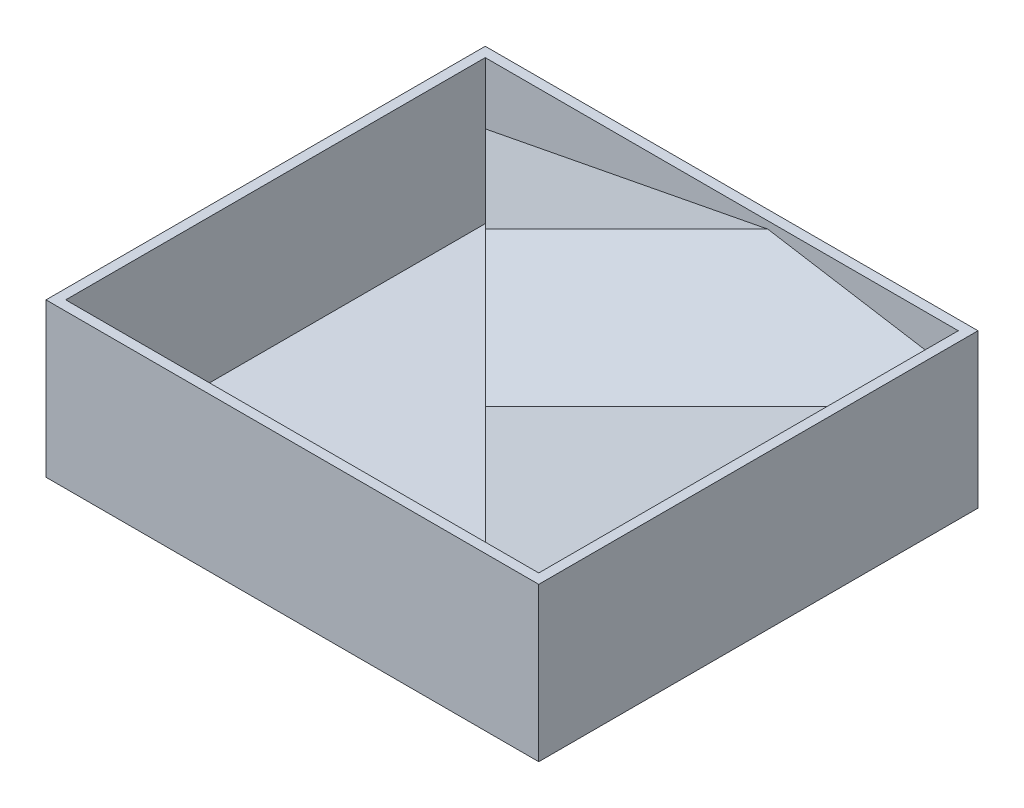
ISO-10303-21;
HEADER;
FILE_DESCRIPTION(('STEP AP214'),'2;1');
FILE_NAME('part.step','',(''),(''),'','','');
FILE_SCHEMA(('AUTOMOTIVE_DESIGN { 1 0 10303 214 1 1 1 1 }'));
ENDSEC;
DATA;
#1=APPLICATION_CONTEXT('core data for automotive mechanical design processes');
#2=APPLICATION_PROTOCOL_DEFINITION('international standard','automotive_design',2000,#1);
#3=PRODUCT_CONTEXT('',#1,'mechanical');
#4=PRODUCT('Part','Part','',(#3));
#5=PRODUCT_RELATED_PRODUCT_CATEGORY('part','',(#4));
#6=PRODUCT_DEFINITION_FORMATION('','',#4);
#7=PRODUCT_DEFINITION_CONTEXT('part definition',#1,'design');
#8=PRODUCT_DEFINITION('design','',#6,#7);
#9=PRODUCT_DEFINITION_SHAPE('','',#8);
#10=(LENGTH_UNIT() NAMED_UNIT(*) SI_UNIT(.MILLI.,.METRE.));
#11=(NAMED_UNIT(*) PLANE_ANGLE_UNIT() SI_UNIT($,.RADIAN.));
#12=(NAMED_UNIT(*) SI_UNIT($,.STERADIAN.) SOLID_ANGLE_UNIT());
#13=UNCERTAINTY_MEASURE_WITH_UNIT(LENGTH_MEASURE(1.E-05),#10,'distance_accuracy_value','');
#14=(GEOMETRIC_REPRESENTATION_CONTEXT(3) GLOBAL_UNCERTAINTY_ASSIGNED_CONTEXT((#13)) GLOBAL_UNIT_ASSIGNED_CONTEXT((#10,
#11,#12)) REPRESENTATION_CONTEXT('',''));
#15=CARTESIAN_POINT('',(0.,0.,0.));
#16=DIRECTION('',(0.,0.,1.));
#17=DIRECTION('',(1.,0.,0.));
#18=AXIS2_PLACEMENT_3D('',#15,#16,#17);
#19=CARTESIAN_POINT('',(62.0602912861796,39.624,-63.9370439423789));
#20=DIRECTION('',(-1.,0.,0.));
#21=DIRECTION('',(0.,0.,1.));
#22=AXIS2_PLACEMENT_3D('',#19,#20,#21);
#23=PLANE('',#22);
#24=DIRECTION('',(0.,-0.0967450022136603,-0.995309200473239));
#25=VECTOR('',#24,1.);
#26=CARTESIAN_POINT('',(62.0602912861796,24.2577204448423,-62.4434269348474));
#27=LINE('',#26,#25);
#28=CARTESIAN_POINT('',(62.0602912861796,34.8768301423718,46.8056023787655));
#29=VERTEX_POINT('',#28);
#30=CARTESIAN_POINT('',(62.0602912861796,25.357,-51.1340773032851));
#31=VERTEX_POINT('',#30);
#32=EDGE_CURVE('E51',#29,#31,#27,.T.);
#33=ORIENTED_EDGE('',*,*,#32,.T.);
#34=DIRECTION('',(0.,0.162584559288982,-0.986694613890644));
#35=VECTOR('',#34,1.);
#36=CARTESIAN_POINT('',(62.0602912861796,27.7879988198752,-65.8873444796714));
#37=LINE('',#36,#35);
#38=CARTESIAN_POINT('',(62.0602912861796,27.0481006551816,-61.397043942379));
#39=VERTEX_POINT('',#38);
#40=EDGE_CURVE('E190',#31,#39,#37,.T.);
#41=ORIENTED_EDGE('',*,*,#40,.T.);
#42=DIRECTION('',(0.,-1.,0.));
#43=VECTOR('',#42,1.);
#44=CARTESIAN_POINT('',(62.0602912861796,39.624,-61.397043942379));
#45=LINE('',#44,#43);
#46=CARTESIAN_POINT('',(62.0602912861796,2.54,-61.397043942379));
#47=VERTEX_POINT('',#46);
#48=EDGE_CURVE('E218',#39,#47,#45,.T.);
#49=ORIENTED_EDGE('',*,*,#48,.T.);
#50=DIRECTION('',(0.,0.,-1.));
#51=VECTOR('',#50,1.);
#52=CARTESIAN_POINT('',(62.0602912861796,2.54,-63.9370439423789));
#53=LINE('',#52,#51);
#54=CARTESIAN_POINT('',(62.0602912861796,2.54,46.8056023787655));
#55=VERTEX_POINT('',#54);
#56=EDGE_CURVE('E221',#55,#47,#53,.T.);
#57=ORIENTED_EDGE('',*,*,#56,.F.);
#58=DIRECTION('',(0.,-1.,0.));
#59=VECTOR('',#58,1.);
#60=CARTESIAN_POINT('',(62.0602912861796,39.624,46.8056023787655));
#61=LINE('',#60,#59);
#62=EDGE_CURVE('E227',#29,#55,#61,.T.);
#63=ORIENTED_EDGE('',*,*,#62,.F.);
#64=EDGE_LOOP('',(#33,#41,#49,#57,#63));
#65=FACE_BOUND('',#64,.T.);
#66=ADVANCED_FACE('F43',(#65),#23,.T.);
#67=CARTESIAN_POINT('',(-62.4778997860176,39.624,-61.397043942379));
#68=DIRECTION('',(0.,0.,1.));
#69=DIRECTION('',(1.,0.,0.));
#70=AXIS2_PLACEMENT_3D('',#67,#68,#69);
#71=PLANE('',#70);
#72=DIRECTION('',(-0.986694613890644,0.162584559288982,0.));
#73=VECTOR('',#72,1.);
#74=CARTESIAN_POINT('',(-61.2033319918938,47.3591083214804,-61.397043942379));
#75=LINE('',#74,#73);
#76=CARTESIAN_POINT('',(12.9885137023479,35.134,-61.397043942379));
#77=VERTEX_POINT('',#76);
#78=EDGE_CURVE('E272',#39,#77,#75,.T.);
#79=ORIENTED_EDGE('',*,*,#78,.T.);
#80=DIRECTION('',(-0.981937401623452,-0.189206076258095,0.));
#81=VECTOR('',#80,1.);
#82=CARTESIAN_POINT('',(-58.9420917631022,21.2739437474469,-61.397043942379));
#83=LINE('',#82,#81);
#84=CARTESIAN_POINT('',(-59.9378997860176,21.0820649897881,-61.397043942379));
#85=VERTEX_POINT('',#84);
#86=EDGE_CURVE('E274',#77,#85,#83,.T.);
#87=ORIENTED_EDGE('',*,*,#86,.T.);
#88=DIRECTION('',(0.,-1.,0.));
#89=VECTOR('',#88,1.);
#90=CARTESIAN_POINT('',(-59.9378997860176,39.624,-61.397043942379));
#91=LINE('',#90,#89);
#92=CARTESIAN_POINT('',(-59.9378997860176,2.54,-61.397043942379));
#93=VERTEX_POINT('',#92);
#94=EDGE_CURVE('E222',#85,#93,#91,.T.);
#95=ORIENTED_EDGE('',*,*,#94,.T.);
#96=DIRECTION('',(-1.,0.,0.));
#97=VECTOR('',#96,1.);
#98=CARTESIAN_POINT('',(-62.4778997860176,2.54,-61.397043942379));
#99=LINE('',#98,#97);
#100=EDGE_CURVE('E229',#47,#93,#99,.T.);
#101=ORIENTED_EDGE('',*,*,#100,.F.);
#102=ORIENTED_EDGE('',*,*,#48,.F.);
#103=EDGE_LOOP('',(#79,#87,#95,#101,#102));
#104=FACE_BOUND('',#103,.T.);
#105=ADVANCED_FACE('F308',(#104),#71,.T.);
#106=CARTESIAN_POINT('',(-62.4778997860176,39.624,-63.9370439423789));
#107=DIRECTION('',(1.,0.,0.));
#108=DIRECTION('',(0.,0.,-1.));
#109=AXIS2_PLACEMENT_3D('',#106,#107,#108);
#110=PLANE('',#109);
#111=DIRECTION('',(0.,0.,1.));
#112=VECTOR('',#111,1.);
#113=CARTESIAN_POINT('',(-62.4778997860176,0.,-63.9370439423789));
#114=LINE('',#113,#112);
#115=CARTESIAN_POINT('',(-62.4778997860176,0.,-63.9370439423789));
#116=VERTEX_POINT('',#115);
#117=CARTESIAN_POINT('',(-62.4778997860176,0.,49.3456023787655));
#118=VERTEX_POINT('',#117);
#119=EDGE_CURVE('E211',#116,#118,#114,.T.);
#120=ORIENTED_EDGE('',*,*,#119,.T.);
#121=DIRECTION('',(0.,-1.,0.));
#122=VECTOR('',#121,1.);
#123=CARTESIAN_POINT('',(-62.4778997860176,39.624,49.3456023787655));
#124=LINE('',#123,#122);
#125=CARTESIAN_POINT('',(-62.4778997860176,39.624,49.3456023787655));
#126=VERTEX_POINT('',#125);
#127=EDGE_CURVE('E270',#126,#118,#124,.T.);
#128=ORIENTED_EDGE('',*,*,#127,.F.);
#129=DIRECTION('',(0.,0.,1.));
#130=VECTOR('',#129,1.);
#131=CARTESIAN_POINT('',(-62.4778997860176,39.624,-63.9370439423789));
#132=LINE('',#131,#130);
#133=CARTESIAN_POINT('',(-62.4778997860176,39.624,-63.9370439423789));
#134=VERTEX_POINT('',#133);
#135=EDGE_CURVE('E245',#134,#126,#132,.T.);
#136=ORIENTED_EDGE('',*,*,#135,.F.);
#137=DIRECTION('',(0.,-1.,0.));
#138=VECTOR('',#137,1.);
#139=CARTESIAN_POINT('',(-62.4778997860176,39.624,-63.9370439423789));
#140=LINE('',#139,#138);
#141=EDGE_CURVE('E255',#134,#116,#140,.T.);
#142=ORIENTED_EDGE('',*,*,#141,.T.);
#143=EDGE_LOOP('',(#120,#128,#136,#142));
#144=FACE_BOUND('',#143,.T.);
#145=ADVANCED_FACE('F44',(#144),#110,.F.);
#146=CARTESIAN_POINT('',(-62.4778997860176,39.624,49.3456023787655));
#147=DIRECTION('',(0.,0.,-1.));
#148=DIRECTION('',(-1.,0.,0.));
#149=AXIS2_PLACEMENT_3D('',#146,#147,#148);
#150=PLANE('',#149);
#151=DIRECTION('',(1.,0.,0.));
#152=VECTOR('',#151,1.);
#153=CARTESIAN_POINT('',(-62.4778997860176,0.,49.3456023787655));
#154=LINE('',#153,#152);
#155=CARTESIAN_POINT('',(64.6002912861796,0.,49.3456023787655));
#156=VERTEX_POINT('',#155);
#157=EDGE_CURVE('E253',#118,#156,#154,.T.);
#158=ORIENTED_EDGE('',*,*,#157,.T.);
#159=DIRECTION('',(0.,-1.,0.));
#160=VECTOR('',#159,1.);
#161=CARTESIAN_POINT('',(64.6002912861796,39.624,49.3456023787655));
#162=LINE('',#161,#160);
#163=CARTESIAN_POINT('',(64.6002912861796,39.624,49.3456023787655));
#164=VERTEX_POINT('',#163);
#165=EDGE_CURVE('E267',#164,#156,#162,.T.);
#166=ORIENTED_EDGE('',*,*,#165,.F.);
#167=DIRECTION('',(1.,0.,0.));
#168=VECTOR('',#167,1.);
#169=CARTESIAN_POINT('',(-62.4778997860176,39.624,49.3456023787655));
#170=LINE('',#169,#168);
#171=EDGE_CURVE('E244',#126,#164,#170,.T.);
#172=ORIENTED_EDGE('',*,*,#171,.F.);
#173=ORIENTED_EDGE('',*,*,#127,.T.);
#174=EDGE_LOOP('',(#158,#166,#172,#173));
#175=FACE_BOUND('',#174,.T.);
#176=ADVANCED_FACE('F328',(#175),#150,.F.);
#177=CARTESIAN_POINT('',(64.6002912861796,39.624,-63.9370439423789));
#178=DIRECTION('',(-1.,0.,0.));
#179=DIRECTION('',(0.,0.,1.));
#180=AXIS2_PLACEMENT_3D('',#177,#178,#179);
#181=PLANE('',#180);
#182=DIRECTION('',(0.,0.,-1.));
#183=VECTOR('',#182,1.);
#184=CARTESIAN_POINT('',(64.6002912861796,0.,-63.9370439423789));
#185=LINE('',#184,#183);
#186=CARTESIAN_POINT('',(64.6002912861796,0.,-63.9370439423789));
#187=VERTEX_POINT('',#186);
#188=EDGE_CURVE('E259',#156,#187,#185,.T.);
#189=ORIENTED_EDGE('',*,*,#188,.T.);
#190=DIRECTION('',(0.,-1.,0.));
#191=VECTOR('',#190,1.);
#192=CARTESIAN_POINT('',(64.6002912861796,39.624,-63.9370439423789));
#193=LINE('',#192,#191);
#194=CARTESIAN_POINT('',(64.6002912861796,39.624,-63.9370439423789));
#195=VERTEX_POINT('',#194);
#196=EDGE_CURVE('E263',#195,#187,#193,.T.);
#197=ORIENTED_EDGE('',*,*,#196,.F.);
#198=DIRECTION('',(0.,0.,-1.));
#199=VECTOR('',#198,1.);
#200=CARTESIAN_POINT('',(64.6002912861796,39.624,-63.9370439423789));
#201=LINE('',#200,#199);
#202=EDGE_CURVE('E247',#164,#195,#201,.T.);
#203=ORIENTED_EDGE('',*,*,#202,.F.);
#204=ORIENTED_EDGE('',*,*,#165,.T.);
#205=EDGE_LOOP('',(#189,#197,#203,#204));
#206=FACE_BOUND('',#205,.T.);
#207=ADVANCED_FACE('F331',(#206),#181,.F.);
#208=CARTESIAN_POINT('',(-62.4778997860176,39.624,-63.9370439423789));
#209=DIRECTION('',(0.,0.,1.));
#210=DIRECTION('',(1.,0.,0.));
#211=AXIS2_PLACEMENT_3D('',#208,#209,#210);
#212=PLANE('',#211);
#213=DIRECTION('',(-1.,0.,0.));
#214=VECTOR('',#213,1.);
#215=CARTESIAN_POINT('',(-62.4778997860176,0.,-63.9370439423789));
#216=LINE('',#215,#214);
#217=EDGE_CURVE('E246',#187,#116,#216,.T.);
#218=ORIENTED_EDGE('',*,*,#217,.T.);
#219=ORIENTED_EDGE('',*,*,#141,.F.);
#220=DIRECTION('',(-1.,0.,0.));
#221=VECTOR('',#220,1.);
#222=CARTESIAN_POINT('',(-62.4778997860176,39.624,-63.9370439423789));
#223=LINE('',#222,#221);
#224=EDGE_CURVE('E249',#195,#134,#223,.T.);
#225=ORIENTED_EDGE('',*,*,#224,.F.);
#226=ORIENTED_EDGE('',*,*,#196,.T.);
#227=EDGE_LOOP('',(#218,#219,#225,#226));
#228=FACE_BOUND('',#227,.T.);
#229=ADVANCED_FACE('F316',(#228),#212,.F.);
#230=CARTESIAN_POINT('',(0.,39.624,0.));
#231=DIRECTION('',(0.,1.,0.));
#232=DIRECTION('',(0.,0.,1.));
#233=AXIS2_PLACEMENT_3D('',#230,#231,#232);
#234=PLANE('',#233);
#235=DIRECTION('',(0.,0.,1.));
#236=VECTOR('',#235,1.);
#237=CARTESIAN_POINT('',(-59.9378997860176,39.624,-63.9370439423789));
#238=LINE('',#237,#236);
#239=CARTESIAN_POINT('',(-59.9378997860176,39.624,-61.397043942379));
#240=VERTEX_POINT('',#239);
#241=CARTESIAN_POINT('',(-59.9378997860176,39.624,46.8056023787655));
#242=VERTEX_POINT('',#241);
#243=EDGE_CURVE('E234',#240,#242,#238,.T.);
#244=ORIENTED_EDGE('',*,*,#243,.F.);
#245=DIRECTION('',(-1.,0.,0.));
#246=VECTOR('',#245,1.);
#247=CARTESIAN_POINT('',(-62.4778997860176,39.624,-61.397043942379));
#248=LINE('',#247,#246);
#249=CARTESIAN_POINT('',(62.0602912861796,39.624,-61.397043942379));
#250=VERTEX_POINT('',#249);
#251=EDGE_CURVE('E239',#250,#240,#248,.T.);
#252=ORIENTED_EDGE('',*,*,#251,.F.);
#253=DIRECTION('',(0.,0.,-1.));
#254=VECTOR('',#253,1.);
#255=CARTESIAN_POINT('',(62.0602912861796,39.624,-63.9370439423789));
#256=LINE('',#255,#254);
#257=CARTESIAN_POINT('',(62.0602912861796,39.624,46.8056023787655));
#258=VERTEX_POINT('',#257);
#259=EDGE_CURVE('E238',#258,#250,#256,.T.);
#260=ORIENTED_EDGE('',*,*,#259,.F.);
#261=DIRECTION('',(1.,0.,0.));
#262=VECTOR('',#261,1.);
#263=CARTESIAN_POINT('',(-62.4778997860176,39.624,46.8056023787655));
#264=LINE('',#263,#262);
#265=EDGE_CURVE('E236',#242,#258,#264,.T.);
#266=ORIENTED_EDGE('',*,*,#265,.F.);
#267=EDGE_LOOP('',(#244,#252,#260,#266));
#268=FACE_BOUND('',#267,.T.);
#269=ORIENTED_EDGE('',*,*,#135,.T.);
#270=ORIENTED_EDGE('',*,*,#171,.T.);
#271=ORIENTED_EDGE('',*,*,#202,.T.);
#272=ORIENTED_EDGE('',*,*,#224,.T.);
#273=EDGE_LOOP('',(#269,#270,#271,#272));
#274=FACE_BOUND('',#273,.T.);
#275=ADVANCED_FACE('F313',(#268,#274),#234,.T.);
#276=CARTESIAN_POINT('',(0.,0.,0.));
#277=DIRECTION('',(0.,1.,0.));
#278=DIRECTION('',(0.,0.,1.));
#279=AXIS2_PLACEMENT_3D('',#276,#277,#278);
#280=PLANE('',#279);
#281=ORIENTED_EDGE('',*,*,#119,.F.);
#282=ORIENTED_EDGE('',*,*,#217,.F.);
#283=ORIENTED_EDGE('',*,*,#188,.F.);
#284=ORIENTED_EDGE('',*,*,#157,.F.);
#285=EDGE_LOOP('',(#281,#282,#283,#284));
#286=FACE_BOUND('',#285,.T.);
#287=ADVANCED_FACE('F319',(#286),#280,.F.);
#288=CARTESIAN_POINT('',(-59.9378997860176,39.624,-63.9370439423789));
#289=DIRECTION('',(1.,0.,0.));
#290=DIRECTION('',(0.,0.,-1.));
#291=AXIS2_PLACEMENT_3D('',#288,#289,#290);
#292=PLANE('',#291);
#293=DIRECTION('',(0.,0.,1.));
#294=VECTOR('',#293,1.);
#295=CARTESIAN_POINT('',(-59.9378997860176,2.54,-63.9370439423789));
#296=LINE('',#295,#294);
#297=CARTESIAN_POINT('',(-59.9378997860176,2.54,46.8056023787655));
#298=VERTEX_POINT('',#297);
#299=EDGE_CURVE('E198',#93,#298,#296,.T.);
#300=ORIENTED_EDGE('',*,*,#299,.F.);
#301=ORIENTED_EDGE('',*,*,#94,.F.);
#302=CARTESIAN_POINT('',(-59.9378997860176,23.7146817699346,-61.397043942379));
#303=VERTEX_POINT('',#302);
#304=EDGE_CURVE('E220',#303,#85,#91,.T.);
#305=ORIENTED_EDGE('',*,*,#304,.F.);
#306=EDGE_CURVE('E216',#240,#303,#91,.T.);
#307=ORIENTED_EDGE('',*,*,#306,.F.);
#308=ORIENTED_EDGE('',*,*,#243,.T.);
#309=DIRECTION('',(0.,-1.,0.));
#310=VECTOR('',#309,1.);
#311=CARTESIAN_POINT('',(-59.9378997860176,39.624,46.8056023787655));
#312=LINE('',#311,#310);
#313=EDGE_CURVE('E212',#242,#298,#312,.T.);
#314=ORIENTED_EDGE('',*,*,#313,.T.);
#315=EDGE_LOOP('',(#300,#301,#305,#307,#308,#314));
#316=FACE_BOUND('',#315,.T.);
#317=ADVANCED_FACE('F302',(#316),#292,.T.);
#318=CARTESIAN_POINT('',(-62.4778997860176,39.624,46.8056023787655));
#319=DIRECTION('',(0.,0.,-1.));
#320=DIRECTION('',(-1.,0.,0.));
#321=AXIS2_PLACEMENT_3D('',#318,#319,#320);
#322=PLANE('',#321);
#323=DIRECTION('',(0.995309200473239,0.0967450022136603,0.));
#324=VECTOR('',#323,1.);
#325=CARTESIAN_POINT('',(-61.1020416653543,25.4692197559756,46.8056023787655));
#326=LINE('',#325,#324);
#327=CARTESIAN_POINT('',(48.2647465351268,36.0997757294617,46.8056023787655));
#328=VERTEX_POINT('',#327);
#329=CARTESIAN_POINT('',(62.0602912861796,37.440715818074,46.8056023787655));
#330=VERTEX_POINT('',#329);
#331=EDGE_CURVE('E197',#328,#330,#326,.T.);
#332=ORIENTED_EDGE('',*,*,#331,.F.);
#333=DIRECTION('',(0.,1.,0.));
#334=VECTOR('',#333,1.);
#335=CARTESIAN_POINT('',(48.2647465351269,39.624,46.8056023787655));
#336=LINE('',#335,#334);
#337=CARTESIAN_POINT('',(48.2647465351268,33.5358900537595,46.8056023787655));
#338=VERTEX_POINT('',#337);
#339=EDGE_CURVE('E174',#338,#328,#336,.T.);
#340=ORIENTED_EDGE('',*,*,#339,.F.);
#341=DIRECTION('',(0.995309200473239,0.0967450022136603,0.));
#342=VECTOR('',#341,1.);
#343=CARTESIAN_POINT('',(-60.855162060558,22.9293310129866,46.8056023787655));
#344=LINE('',#343,#342);
#345=EDGE_CURVE('E200',#338,#29,#344,.T.);
#346=ORIENTED_EDGE('',*,*,#345,.T.);
#347=ORIENTED_EDGE('',*,*,#62,.T.);
#348=DIRECTION('',(1.,0.,0.));
#349=VECTOR('',#348,1.);
#350=CARTESIAN_POINT('',(-62.4778997860176,2.54,46.8056023787655));
#351=LINE('',#350,#349);
#352=EDGE_CURVE('E208',#298,#55,#351,.T.);
#353=ORIENTED_EDGE('',*,*,#352,.F.);
#354=ORIENTED_EDGE('',*,*,#313,.F.);
#355=ORIENTED_EDGE('',*,*,#265,.T.);
#356=EDGE_CURVE('E213',#258,#330,#61,.T.);
#357=ORIENTED_EDGE('',*,*,#356,.T.);
#358=EDGE_LOOP('',(#332,#340,#346,#347,#353,#354,#355,#357));
#359=FACE_BOUND('',#358,.T.);
#360=ADVANCED_FACE('F286',(#359),#322,.T.);
#361=DIRECTION('',(0.,0.162584559288982,-0.986694613890644));
#362=VECTOR('',#361,1.);
#363=CARTESIAN_POINT('',(62.0602912861796,30.3271112617618,-65.4689571979961));
#364=LINE('',#363,#362);
#365=CARTESIAN_POINT('',(62.0602912861796,27.9372729695821,-50.9654853967646));
#366=VERTEX_POINT('',#365);
#367=CARTESIAN_POINT('',(62.0602912861796,29.6561536900801,-61.397043942379));
#368=VERTEX_POINT('',#367);
#369=EDGE_CURVE('E204',#366,#368,#364,.T.);
#370=ORIENTED_EDGE('',*,*,#369,.F.);
#371=DIRECTION('',(0.,-0.0967450022136603,-0.995309200473239));
#372=VECTOR('',#371,1.);
#373=CARTESIAN_POINT('',(62.0602912861796,26.7976091878313,-62.6903065396437));
#374=LINE('',#373,#372);
#375=EDGE_CURVE('E11',#330,#366,#374,.T.);
#376=ORIENTED_EDGE('',*,*,#375,.F.);
#377=ORIENTED_EDGE('',*,*,#356,.F.);
#378=ORIENTED_EDGE('',*,*,#259,.T.);
#379=EDGE_CURVE('E66',#250,#368,#45,.T.);
#380=ORIENTED_EDGE('',*,*,#379,.T.);
#381=EDGE_LOOP('',(#370,#376,#377,#378,#380));
#382=FACE_BOUND('',#381,.T.);
#383=ADVANCED_FACE('F292',(#382),#23,.T.);
#384=DIRECTION('',(-0.981937401623452,-0.189206076258095,0.));
#385=VECTOR('',#384,1.);
#386=CARTESIAN_POINT('',(-59.431201746027,23.8123156392992,-61.397043942379));
#387=LINE('',#386,#385);
#388=CARTESIAN_POINT('',(12.9197969049129,37.753375981299,-61.397043942379));
#389=VERTEX_POINT('',#388);
#390=EDGE_CURVE('E276',#389,#303,#387,.T.);
#391=ORIENTED_EDGE('',*,*,#390,.F.);
#392=DIRECTION('',(-0.986694613890644,0.162584559288982,0.));
#393=VECTOR('',#392,1.);
#394=CARTESIAN_POINT('',(-60.7849447102186,49.8982207633671,-61.397043942379));
#395=LINE('',#394,#393);
#396=EDGE_CURVE('E280',#368,#389,#395,.T.);
#397=ORIENTED_EDGE('',*,*,#396,.F.);
#398=ORIENTED_EDGE('',*,*,#379,.F.);
#399=ORIENTED_EDGE('',*,*,#251,.T.);
#400=ORIENTED_EDGE('',*,*,#306,.T.);
#401=EDGE_LOOP('',(#391,#397,#398,#399,#400));
#402=FACE_BOUND('',#401,.T.);
#403=ADVANCED_FACE('F294',(#402),#71,.T.);
#404=CARTESIAN_POINT('',(0.,2.54,0.));
#405=DIRECTION('',(0.,1.,0.));
#406=DIRECTION('',(0.,0.,1.));
#407=AXIS2_PLACEMENT_3D('',#404,#405,#406);
#408=PLANE('',#407);
#409=ORIENTED_EDGE('',*,*,#299,.T.);
#410=ORIENTED_EDGE('',*,*,#352,.T.);
#411=ORIENTED_EDGE('',*,*,#56,.T.);
#412=ORIENTED_EDGE('',*,*,#100,.T.);
#413=EDGE_LOOP('',(#409,#410,#411,#412));
#414=FACE_BOUND('',#413,.T.);
#415=ADVANCED_FACE('F309',(#414),#408,.T.);
#416=CARTESIAN_POINT('',(79.5818776754174,39.624,78.122733519056));
#417=DIRECTION('',(-0.707106781186547,0.,0.707106781186548));
#418=DIRECTION('',(0.700519231896705,0.136182273022966,0.700519231896705));
#419=AXIS2_PLACEMENT_3D('',#416,#417,#418);
#420=PLANE('',#419);
#421=DIRECTION('',(0.700519231896705,0.136182273022966,0.700519231896705));
#422=VECTOR('',#421,1.);
#423=CARTESIAN_POINT('',(6.19267906962794,25.357,4.73353491326659));
#424=LINE('',#423,#422);
#425=CARTESIAN_POINT('',(6.19267906962794,25.357,4.73353491326659));
#426=VERTEX_POINT('',#425);
#427=EDGE_CURVE('E192',#426,#338,#424,.T.);
#428=ORIENTED_EDGE('',*,*,#427,.T.);
#429=ORIENTED_EDGE('',*,*,#339,.T.);
#430=DIRECTION('',(0.700519231896705,0.136182273022966,0.700519231896705));
#431=VECTOR('',#430,1.);
#432=CARTESIAN_POINT('',(5.94808873144882,27.8733368480668,4.48894457508747));
#433=LINE('',#432,#431);
#434=CARTESIAN_POINT('',(6.27697502288816,27.9372729695821,4.81783086652681));
#435=VERTEX_POINT('',#434);
#436=EDGE_CURVE('E171',#435,#328,#433,.T.);
#437=ORIENTED_EDGE('',*,*,#436,.F.);
#438=DIRECTION('',(0.688655943794372,-0.226949294234123,0.688655943794372));
#439=VECTOR('',#438,1.);
#440=CARTESIAN_POINT('',(-23.0670804840912,37.607722701828,-24.5262246404525));
#441=LINE('',#440,#439);
#442=CARTESIAN_POINT('',(-23.5090514405523,37.753375981299,-24.9681955969137));
#443=VERTEX_POINT('',#442);
#444=EDGE_CURVE('E160',#443,#435,#441,.T.);
#445=ORIENTED_EDGE('',*,*,#444,.F.);
#446=DIRECTION('',(0.682230409590376,0.262913172854267,0.682230409590375));
#447=VECTOR('',#446,1.);
#448=CARTESIAN_POINT('',(-60.4102739532484,23.5326415246814,-61.8694181096097));
#449=LINE('',#448,#447);
#450=EDGE_CURVE('E166',#303,#443,#449,.T.);
#451=ORIENTED_EDGE('',*,*,#450,.F.);
#452=ORIENTED_EDGE('',*,*,#304,.T.);
#453=DIRECTION('',(0.682230409590376,0.262913172854267,0.682230409590375));
#454=VECTOR('',#453,1.);
#455=CARTESIAN_POINT('',(-59.9380684272816,21.082,-61.3972125836429));
#456=LINE('',#455,#454);
#457=CARTESIAN_POINT('',(-23.4746930418348,35.134,-24.9338371981962));
#458=VERTEX_POINT('',#457);
#459=EDGE_CURVE('E181',#85,#458,#456,.T.);
#460=ORIENTED_EDGE('',*,*,#459,.T.);
#461=DIRECTION('',(0.688655943794372,-0.226949294234123,0.688655943794372));
#462=VECTOR('',#461,1.);
#463=CARTESIAN_POINT('',(-23.4746930418348,35.134,-24.9338371981962));
#464=LINE('',#463,#462);
#465=EDGE_CURVE('E182',#458,#426,#464,.T.);
#466=ORIENTED_EDGE('',*,*,#465,.T.);
#467=EDGE_LOOP('',(#428,#429,#437,#445,#451,#452,#460,#466));
#468=FACE_BOUND('',#467,.T.);
#469=ADVANCED_FACE('F173',(#468),#420,.T.);
#470=CARTESIAN_POINT('',(-60.4102739532484,23.5326415246814,-61.8694181096097));
#471=DIRECTION('',(-0.185907687388523,0.96481949790606,-0.185907687388523));
#472=DIRECTION('',(-0.981937401623452,-0.189206076258095,0.));
#473=AXIS2_PLACEMENT_3D('',#470,#471,#472);
#474=PLANE('',#473);
#475=DIRECTION('',(0.707106781186547,0.,-0.707106781186548));
#476=VECTOR('',#475,1.);
#477=CARTESIAN_POINT('',(-23.5090514405524,37.753375981299,-24.9681955969137));
#478=LINE('',#477,#476);
#479=EDGE_CURVE('E164',#443,#389,#478,.T.);
#480=ORIENTED_EDGE('',*,*,#479,.T.);
#481=ORIENTED_EDGE('',*,*,#390,.T.);
#482=ORIENTED_EDGE('',*,*,#450,.T.);
#483=EDGE_LOOP('',(#480,#481,#482));
#484=FACE_BOUND('',#483,.T.);
#485=ADVANCED_FACE('F296',(#484),#474,.T.);
#486=CARTESIAN_POINT('',(-23.0670804840912,37.607722701828,-24.5262246404525));
#487=DIRECTION('',(0.160477384938449,0.973906575522844,0.160477384938449));
#488=DIRECTION('',(-0.986694613890644,0.162584559288982,0.));
#489=AXIS2_PLACEMENT_3D('',#486,#487,#488);
#490=PLANE('',#489);
#491=DIRECTION('',(0.707106781186547,0.,-0.707106781186548));
#492=VECTOR('',#491,1.);
#493=CARTESIAN_POINT('',(6.27697502288816,27.9372729695821,4.81783086652681));
#494=LINE('',#493,#492);
#495=EDGE_CURVE('E162',#435,#366,#494,.T.);
#496=ORIENTED_EDGE('',*,*,#495,.T.);
#497=ORIENTED_EDGE('',*,*,#369,.T.);
#498=ORIENTED_EDGE('',*,*,#396,.T.);
#499=ORIENTED_EDGE('',*,*,#479,.F.);
#500=ORIENTED_EDGE('',*,*,#444,.T.);
#501=EDGE_LOOP('',(#496,#497,#498,#499,#500));
#502=FACE_BOUND('',#501,.T.);
#503=ADVANCED_FACE('F158',(#502),#490,.T.);
#504=CARTESIAN_POINT('',(5.94808873144882,27.8733368480668,4.48894457508747));
#505=DIRECTION('',(-0.0962954087319371,0.990683798451503,-0.0962954087319371));
#506=DIRECTION('',(-0.995309200473239,-0.0967450022136603,0.));
#507=AXIS2_PLACEMENT_3D('',#504,#505,#506);
#508=PLANE('',#507);
#509=ORIENTED_EDGE('',*,*,#436,.T.);
#510=ORIENTED_EDGE('',*,*,#331,.T.);
#511=ORIENTED_EDGE('',*,*,#375,.T.);
#512=ORIENTED_EDGE('',*,*,#495,.F.);
#513=EDGE_LOOP('',(#509,#510,#511,#512));
#514=FACE_BOUND('',#513,.T.);
#515=ADVANCED_FACE('F177',(#514),#508,.T.);
#516=CARTESIAN_POINT('',(-59.9380684272816,21.082,-61.3972125836429));
#517=DIRECTION('',(-0.185907687388523,0.96481949790606,-0.185907687388523));
#518=DIRECTION('',(-0.981937401623452,-0.189206076258095,0.));
#519=AXIS2_PLACEMENT_3D('',#516,#517,#518);
#520=PLANE('',#519);
#521=ORIENTED_EDGE('',*,*,#86,.F.);
#522=DIRECTION('',(0.707106781186547,0.,-0.707106781186548));
#523=VECTOR('',#522,1.);
#524=CARTESIAN_POINT('',(-23.4746930418348,35.134,-24.9338371981962));
#525=LINE('',#524,#523);
#526=EDGE_CURVE('E59',#458,#77,#525,.T.);
#527=ORIENTED_EDGE('',*,*,#526,.F.);
#528=ORIENTED_EDGE('',*,*,#459,.F.);
#529=EDGE_LOOP('',(#521,#527,#528));
#530=FACE_BOUND('',#529,.T.);
#531=ADVANCED_FACE('F361',(#530),#520,.F.);
#532=CARTESIAN_POINT('',(-23.4746930418348,35.134,-24.9338371981962));
#533=DIRECTION('',(0.160477384938449,0.973906575522844,0.160477384938449));
#534=DIRECTION('',(-0.986694613890644,0.162584559288982,0.));
#535=AXIS2_PLACEMENT_3D('',#532,#533,#534);
#536=PLANE('',#535);
#537=ORIENTED_EDGE('',*,*,#40,.F.);
#538=DIRECTION('',(0.707106781186547,0.,-0.707106781186548));
#539=VECTOR('',#538,1.);
#540=CARTESIAN_POINT('',(6.19267906962794,25.357,4.73353491326659));
#541=LINE('',#540,#539);
#542=EDGE_CURVE('E194',#426,#31,#541,.T.);
#543=ORIENTED_EDGE('',*,*,#542,.F.);
#544=ORIENTED_EDGE('',*,*,#465,.F.);
#545=ORIENTED_EDGE('',*,*,#526,.T.);
#546=ORIENTED_EDGE('',*,*,#78,.F.);
#547=EDGE_LOOP('',(#537,#543,#544,#545,#546));
#548=FACE_BOUND('',#547,.T.);
#549=ADVANCED_FACE('F366',(#548),#536,.F.);
#550=CARTESIAN_POINT('',(6.19267906962794,25.357,4.73353491326659));
#551=DIRECTION('',(-0.0962954087319371,0.990683798451503,-0.0962954087319371));
#552=DIRECTION('',(-0.995309200473239,-0.0967450022136603,0.));
#553=AXIS2_PLACEMENT_3D('',#550,#551,#552);
#554=PLANE('',#553);
#555=ORIENTED_EDGE('',*,*,#345,.F.);
#556=ORIENTED_EDGE('',*,*,#427,.F.);
#557=ORIENTED_EDGE('',*,*,#542,.T.);
#558=ORIENTED_EDGE('',*,*,#32,.F.);
#559=EDGE_LOOP('',(#555,#556,#557,#558));
#560=FACE_BOUND('',#559,.T.);
#561=ADVANCED_FACE('F287',(#560),#554,.F.);
#562=CLOSED_SHELL('',(#66,#105,#145,#176,#207,#229,#275,#287,#317,#360,#383,#403,#415,#469,#485,
#503,#515,#531,#549,#561));
#563=MANIFOLD_SOLID_BREP('B2',#562);
#564=ADVANCED_BREP_SHAPE_REPRESENTATION('',(#18,#563),#14);
#565=SHAPE_DEFINITION_REPRESENTATION(#9,#564);
ENDSEC;
END-ISO-10303-21;
